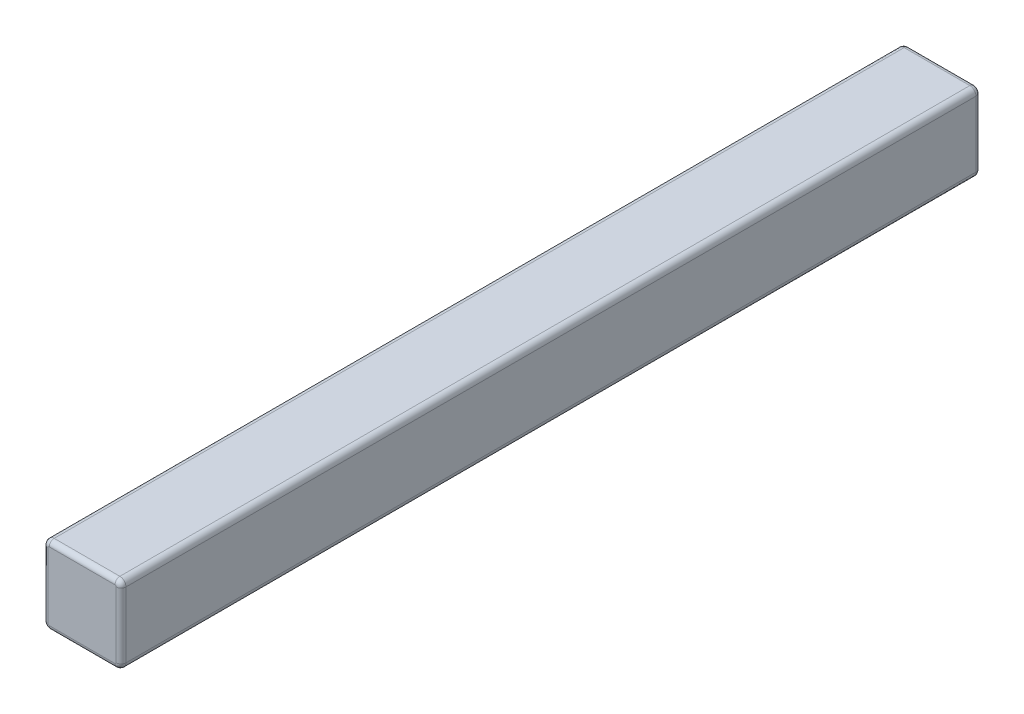
ISO-10303-21;
HEADER;
FILE_DESCRIPTION(('STEP AP214'),'2;1');
FILE_NAME('part.step','',(''),(''),'','','');
FILE_SCHEMA(('AUTOMOTIVE_DESIGN { 1 0 10303 214 1 1 1 1 }'));
ENDSEC;
DATA;
#1=APPLICATION_CONTEXT('core data for automotive mechanical design processes');
#2=APPLICATION_PROTOCOL_DEFINITION('international standard','automotive_design',2000,#1);
#3=PRODUCT_CONTEXT('',#1,'mechanical');
#4=PRODUCT('Part','Part','',(#3));
#5=PRODUCT_RELATED_PRODUCT_CATEGORY('part','',(#4));
#6=PRODUCT_DEFINITION_FORMATION('','',#4);
#7=PRODUCT_DEFINITION_CONTEXT('part definition',#1,'design');
#8=PRODUCT_DEFINITION('design','',#6,#7);
#9=PRODUCT_DEFINITION_SHAPE('','',#8);
#10=(LENGTH_UNIT() NAMED_UNIT(*) SI_UNIT(.MILLI.,.METRE.));
#11=(NAMED_UNIT(*) PLANE_ANGLE_UNIT() SI_UNIT($,.RADIAN.));
#12=(NAMED_UNIT(*) SI_UNIT($,.STERADIAN.) SOLID_ANGLE_UNIT());
#13=UNCERTAINTY_MEASURE_WITH_UNIT(LENGTH_MEASURE(1.E-05),#10,'distance_accuracy_value','');
#14=(GEOMETRIC_REPRESENTATION_CONTEXT(3) GLOBAL_UNCERTAINTY_ASSIGNED_CONTEXT((#13)) GLOBAL_UNIT_ASSIGNED_CONTEXT((#10,
#11,#12)) REPRESENTATION_CONTEXT('',''));
#15=CARTESIAN_POINT('',(0.,0.,0.));
#16=DIRECTION('',(0.,0.,1.));
#17=DIRECTION('',(1.,0.,0.));
#18=AXIS2_PLACEMENT_3D('',#15,#16,#17);
#19=CARTESIAN_POINT('',(-1.3375,1.3375,35.));
#20=DIRECTION('',(0.,0.,-1.));
#21=DIRECTION('',(-1.,0.,0.));
#22=AXIS2_PLACEMENT_3D('',#19,#20,#21);
#23=CYLINDRICAL_SURFACE('',#22,0.25);
#24=DIRECTION('',(0.,0.,-1.));
#25=VECTOR('',#24,1.);
#26=CARTESIAN_POINT('',(-1.3375,1.5875,35.));
#27=LINE('',#26,#25);
#28=CARTESIAN_POINT('',(-1.3375,1.5875,34.8));
#29=VERTEX_POINT('',#28);
#30=CARTESIAN_POINT('',(-1.3375,1.5875,0.199999999999999));
#31=VERTEX_POINT('',#30);
#32=EDGE_CURVE('E267',#29,#31,#27,.T.);
#33=ORIENTED_EDGE('',*,*,#32,.T.);
#34=CARTESIAN_POINT('',(-1.3375,1.3375,0.199999999999999));
#35=DIRECTION('',(0.,0.,1.));
#36=DIRECTION('',(1.,0.,0.));
#37=AXIS2_PLACEMENT_3D('',#34,#35,#36);
#38=CIRCLE('',#37,0.25);
#39=CARTESIAN_POINT('',(-1.5875,1.3375,0.199999999999999));
#40=VERTEX_POINT('',#39);
#41=EDGE_CURVE('E232',#31,#40,#38,.T.);
#42=ORIENTED_EDGE('',*,*,#41,.T.);
#43=DIRECTION('',(0.,0.,-1.));
#44=VECTOR('',#43,1.);
#45=CARTESIAN_POINT('',(-1.5875,1.3375,35.));
#46=LINE('',#45,#44);
#47=CARTESIAN_POINT('',(-1.5875,1.3375,34.8));
#48=VERTEX_POINT('',#47);
#49=EDGE_CURVE('E171',#48,#40,#46,.T.);
#50=ORIENTED_EDGE('',*,*,#49,.F.);
#51=CARTESIAN_POINT('',(-1.3375,1.3375,34.8));
#52=DIRECTION('',(0.,0.,1.));
#53=DIRECTION('',(1.,0.,0.));
#54=AXIS2_PLACEMENT_3D('',#51,#52,#53);
#55=CIRCLE('',#54,0.25);
#56=EDGE_CURVE('E230',#48,#29,#55,.F.);
#57=ORIENTED_EDGE('',*,*,#56,.T.);
#58=EDGE_LOOP('',(#33,#42,#50,#57));
#59=FACE_BOUND('',#58,.T.);
#60=ADVANCED_FACE('F35',(#59),#23,.T.);
#61=CARTESIAN_POINT('',(-1.5875,1.3375,35.));
#62=DIRECTION('',(1.,0.,0.));
#63=DIRECTION('',(0.,0.,-1.));
#64=AXIS2_PLACEMENT_3D('',#61,#62,#63);
#65=PLANE('',#64);
#66=ORIENTED_EDGE('',*,*,#49,.T.);
#67=DIRECTION('',(0.,-1.,0.));
#68=VECTOR('',#67,1.);
#69=CARTESIAN_POINT('',(-1.5875,1.3375,0.199999999999999));
#70=LINE('',#69,#68);
#71=CARTESIAN_POINT('',(-1.5875,-1.3375,0.199999999999999));
#72=VERTEX_POINT('',#71);
#73=EDGE_CURVE('E170',#40,#72,#70,.T.);
#74=ORIENTED_EDGE('',*,*,#73,.T.);
#75=DIRECTION('',(0.,0.,-1.));
#76=VECTOR('',#75,1.);
#77=CARTESIAN_POINT('',(-1.5875,-1.3375,35.));
#78=LINE('',#77,#76);
#79=CARTESIAN_POINT('',(-1.5875,-1.3375,34.8));
#80=VERTEX_POINT('',#79);
#81=EDGE_CURVE('E152',#80,#72,#78,.T.);
#82=ORIENTED_EDGE('',*,*,#81,.F.);
#83=DIRECTION('',(0.,-1.,0.));
#84=VECTOR('',#83,1.);
#85=CARTESIAN_POINT('',(-1.5875,1.3375,34.8));
#86=LINE('',#85,#84);
#87=EDGE_CURVE('E167',#80,#48,#86,.F.);
#88=ORIENTED_EDGE('',*,*,#87,.T.);
#89=EDGE_LOOP('',(#66,#74,#82,#88));
#90=FACE_BOUND('',#89,.T.);
#91=ADVANCED_FACE('F165',(#90),#65,.F.);
#92=CARTESIAN_POINT('',(-1.3375,-1.3375,35.));
#93=DIRECTION('',(0.,0.,-1.));
#94=DIRECTION('',(-1.,0.,0.));
#95=AXIS2_PLACEMENT_3D('',#92,#93,#94);
#96=CYLINDRICAL_SURFACE('',#95,0.25);
#97=ORIENTED_EDGE('',*,*,#81,.T.);
#98=CARTESIAN_POINT('',(-1.3375,-1.3375,0.199999999999999));
#99=DIRECTION('',(0.,0.,1.));
#100=DIRECTION('',(1.,0.,0.));
#101=AXIS2_PLACEMENT_3D('',#98,#99,#100);
#102=CIRCLE('',#101,0.25);
#103=CARTESIAN_POINT('',(-1.3375,-1.5875,0.199999999999999));
#104=VERTEX_POINT('',#103);
#105=EDGE_CURVE('E159',#72,#104,#102,.T.);
#106=ORIENTED_EDGE('',*,*,#105,.T.);
#107=DIRECTION('',(0.,0.,-1.));
#108=VECTOR('',#107,1.);
#109=CARTESIAN_POINT('',(-1.3375,-1.5875,35.));
#110=LINE('',#109,#108);
#111=CARTESIAN_POINT('',(-1.3375,-1.5875,34.8));
#112=VERTEX_POINT('',#111);
#113=EDGE_CURVE('E154',#112,#104,#110,.T.);
#114=ORIENTED_EDGE('',*,*,#113,.F.);
#115=CARTESIAN_POINT('',(-1.3375,-1.3375,34.8));
#116=DIRECTION('',(0.,0.,1.));
#117=DIRECTION('',(1.,0.,0.));
#118=AXIS2_PLACEMENT_3D('',#115,#116,#117);
#119=CIRCLE('',#118,0.25);
#120=EDGE_CURVE('E149',#112,#80,#119,.F.);
#121=ORIENTED_EDGE('',*,*,#120,.T.);
#122=EDGE_LOOP('',(#97,#106,#114,#121));
#123=FACE_BOUND('',#122,.T.);
#124=ADVANCED_FACE('F151',(#123),#96,.T.);
#125=CARTESIAN_POINT('',(-1.3375,-1.5875,35.));
#126=DIRECTION('',(0.,1.,0.));
#127=DIRECTION('',(-1.,0.,0.));
#128=AXIS2_PLACEMENT_3D('',#125,#126,#127);
#129=PLANE('',#128);
#130=ORIENTED_EDGE('',*,*,#113,.T.);
#131=DIRECTION('',(1.,0.,0.));
#132=VECTOR('',#131,1.);
#133=CARTESIAN_POINT('',(-1.3375,-1.5875,0.199999999999999));
#134=LINE('',#133,#132);
#135=CARTESIAN_POINT('',(1.3375,-1.5875,0.199999999999999));
#136=VERTEX_POINT('',#135);
#137=EDGE_CURVE('E211',#104,#136,#134,.T.);
#138=ORIENTED_EDGE('',*,*,#137,.T.);
#139=DIRECTION('',(0.,0.,-1.));
#140=VECTOR('',#139,1.);
#141=CARTESIAN_POINT('',(1.3375,-1.5875,35.));
#142=LINE('',#141,#140);
#143=CARTESIAN_POINT('',(1.3375,-1.5875,34.8));
#144=VERTEX_POINT('',#143);
#145=EDGE_CURVE('E311',#144,#136,#142,.T.);
#146=ORIENTED_EDGE('',*,*,#145,.F.);
#147=DIRECTION('',(1.,0.,0.));
#148=VECTOR('',#147,1.);
#149=CARTESIAN_POINT('',(-1.3375,-1.5875,34.8));
#150=LINE('',#149,#148);
#151=EDGE_CURVE('E209',#144,#112,#150,.F.);
#152=ORIENTED_EDGE('',*,*,#151,.T.);
#153=EDGE_LOOP('',(#130,#138,#146,#152));
#154=FACE_BOUND('',#153,.T.);
#155=ADVANCED_FACE('F316',(#154),#129,.F.);
#156=CARTESIAN_POINT('',(1.3375,-1.3375,35.));
#157=DIRECTION('',(0.,0.,-1.));
#158=DIRECTION('',(-1.,0.,0.));
#159=AXIS2_PLACEMENT_3D('',#156,#157,#158);
#160=CYLINDRICAL_SURFACE('',#159,0.25);
#161=ORIENTED_EDGE('',*,*,#145,.T.);
#162=CARTESIAN_POINT('',(1.3375,-1.3375,0.199999999999999));
#163=DIRECTION('',(0.,0.,1.));
#164=DIRECTION('',(1.,0.,0.));
#165=AXIS2_PLACEMENT_3D('',#162,#163,#164);
#166=CIRCLE('',#165,0.25);
#167=CARTESIAN_POINT('',(1.5875,-1.3375,0.199999999999999));
#168=VERTEX_POINT('',#167);
#169=EDGE_CURVE('E215',#136,#168,#166,.T.);
#170=ORIENTED_EDGE('',*,*,#169,.T.);
#171=DIRECTION('',(0.,0.,-1.));
#172=VECTOR('',#171,1.);
#173=CARTESIAN_POINT('',(1.5875,-1.3375,35.));
#174=LINE('',#173,#172);
#175=CARTESIAN_POINT('',(1.5875,-1.3375,34.8));
#176=VERTEX_POINT('',#175);
#177=EDGE_CURVE('E308',#176,#168,#174,.T.);
#178=ORIENTED_EDGE('',*,*,#177,.F.);
#179=CARTESIAN_POINT('',(1.3375,-1.3375,34.8));
#180=DIRECTION('',(0.,0.,1.));
#181=DIRECTION('',(1.,0.,0.));
#182=AXIS2_PLACEMENT_3D('',#179,#180,#181);
#183=CIRCLE('',#182,0.25);
#184=EDGE_CURVE('E213',#176,#144,#183,.F.);
#185=ORIENTED_EDGE('',*,*,#184,.T.);
#186=EDGE_LOOP('',(#161,#170,#178,#185));
#187=FACE_BOUND('',#186,.T.);
#188=ADVANCED_FACE('F358',(#187),#160,.T.);
#189=CARTESIAN_POINT('',(1.5875,1.3375,35.));
#190=DIRECTION('',(1.,0.,0.));
#191=DIRECTION('',(0.,1.,0.));
#192=AXIS2_PLACEMENT_3D('',#189,#190,#191);
#193=PLANE('',#192);
#194=ORIENTED_EDGE('',*,*,#177,.T.);
#195=DIRECTION('',(0.,-1.,0.));
#196=VECTOR('',#195,1.);
#197=CARTESIAN_POINT('',(1.5875,1.3375,0.2));
#198=LINE('',#197,#196);
#199=CARTESIAN_POINT('',(1.5875,1.3375,0.199999999999999));
#200=VERTEX_POINT('',#199);
#201=EDGE_CURVE('E219',#168,#200,#198,.F.);
#202=ORIENTED_EDGE('',*,*,#201,.T.);
#203=DIRECTION('',(0.,0.,-1.));
#204=VECTOR('',#203,1.);
#205=CARTESIAN_POINT('',(1.5875,1.3375,35.));
#206=LINE('',#205,#204);
#207=CARTESIAN_POINT('',(1.5875,1.3375,34.8));
#208=VERTEX_POINT('',#207);
#209=EDGE_CURVE('E303',#208,#200,#206,.T.);
#210=ORIENTED_EDGE('',*,*,#209,.F.);
#211=DIRECTION('',(0.,-1.,0.));
#212=VECTOR('',#211,1.);
#213=CARTESIAN_POINT('',(1.5875,1.3375,34.8));
#214=LINE('',#213,#212);
#215=EDGE_CURVE('E217',#208,#176,#214,.T.);
#216=ORIENTED_EDGE('',*,*,#215,.T.);
#217=EDGE_LOOP('',(#194,#202,#210,#216));
#218=FACE_BOUND('',#217,.T.);
#219=ADVANCED_FACE('F360',(#218),#193,.T.);
#220=CARTESIAN_POINT('',(1.3375,1.3375,35.));
#221=DIRECTION('',(0.,0.,-1.));
#222=DIRECTION('',(-1.,0.,0.));
#223=AXIS2_PLACEMENT_3D('',#220,#221,#222);
#224=CYLINDRICAL_SURFACE('',#223,0.25);
#225=ORIENTED_EDGE('',*,*,#209,.T.);
#226=CARTESIAN_POINT('',(1.3375,1.3375,0.199999999999999));
#227=DIRECTION('',(0.,0.,1.));
#228=DIRECTION('',(1.,0.,0.));
#229=AXIS2_PLACEMENT_3D('',#226,#227,#228);
#230=CIRCLE('',#229,0.25);
#231=CARTESIAN_POINT('',(1.3375,1.5875,0.199999999999999));
#232=VERTEX_POINT('',#231);
#233=EDGE_CURVE('E223',#200,#232,#230,.T.);
#234=ORIENTED_EDGE('',*,*,#233,.T.);
#235=DIRECTION('',(0.,0.,-1.));
#236=VECTOR('',#235,1.);
#237=CARTESIAN_POINT('',(1.3375,1.5875,35.));
#238=LINE('',#237,#236);
#239=CARTESIAN_POINT('',(1.3375,1.5875,34.8));
#240=VERTEX_POINT('',#239);
#241=EDGE_CURVE('E301',#240,#232,#238,.T.);
#242=ORIENTED_EDGE('',*,*,#241,.F.);
#243=CARTESIAN_POINT('',(1.3375,1.3375,34.8));
#244=DIRECTION('',(0.,0.,1.));
#245=DIRECTION('',(1.,0.,0.));
#246=AXIS2_PLACEMENT_3D('',#243,#244,#245);
#247=CIRCLE('',#246,0.25);
#248=EDGE_CURVE('E221',#240,#208,#247,.F.);
#249=ORIENTED_EDGE('',*,*,#248,.T.);
#250=EDGE_LOOP('',(#225,#234,#242,#249));
#251=FACE_BOUND('',#250,.T.);
#252=ADVANCED_FACE('F411',(#251),#224,.T.);
#253=CARTESIAN_POINT('',(-1.3375,1.5875,35.));
#254=DIRECTION('',(0.,1.,0.));
#255=DIRECTION('',(-1.,0.,0.));
#256=AXIS2_PLACEMENT_3D('',#253,#254,#255);
#257=PLANE('',#256);
#258=ORIENTED_EDGE('',*,*,#241,.T.);
#259=DIRECTION('',(1.,0.,0.));
#260=VECTOR('',#259,1.);
#261=CARTESIAN_POINT('',(-1.3375,1.5875,0.2));
#262=LINE('',#261,#260);
#263=EDGE_CURVE('E228',#232,#31,#262,.F.);
#264=ORIENTED_EDGE('',*,*,#263,.T.);
#265=ORIENTED_EDGE('',*,*,#32,.F.);
#266=DIRECTION('',(1.,0.,0.));
#267=VECTOR('',#266,1.);
#268=CARTESIAN_POINT('',(-1.3375,1.5875,34.8));
#269=LINE('',#268,#267);
#270=EDGE_CURVE('E225',#29,#240,#269,.T.);
#271=ORIENTED_EDGE('',*,*,#270,.T.);
#272=EDGE_LOOP('',(#258,#264,#265,#271));
#273=FACE_BOUND('',#272,.T.);
#274=ADVANCED_FACE('F298',(#273),#257,.T.);
#275=CARTESIAN_POINT('',(-1.3375,1.3375,35.));
#276=DIRECTION('',(0.,0.,1.));
#277=DIRECTION('',(1.,0.,0.));
#278=AXIS2_PLACEMENT_3D('',#275,#276,#277);
#279=PLANE('',#278);
#280=CARTESIAN_POINT('',(1.3375,1.3375,35.));
#281=DIRECTION('',(0.,0.,1.));
#282=DIRECTION('',(1.,0.,0.));
#283=AXIS2_PLACEMENT_3D('',#280,#281,#282);
#284=CIRCLE('',#283,0.0499999999999999);
#285=CARTESIAN_POINT('',(1.3875,1.3375,35.));
#286=VERTEX_POINT('',#285);
#287=CARTESIAN_POINT('',(1.3375,1.3875,35.));
#288=VERTEX_POINT('',#287);
#289=EDGE_CURVE('E44',#286,#288,#284,.T.);
#290=ORIENTED_EDGE('',*,*,#289,.T.);
#291=DIRECTION('',(1.,0.,0.));
#292=VECTOR('',#291,1.);
#293=CARTESIAN_POINT('',(-1.3375,1.3875,35.));
#294=LINE('',#293,#292);
#295=CARTESIAN_POINT('',(-1.3375,1.3875,35.));
#296=VERTEX_POINT('',#295);
#297=EDGE_CURVE('E11',#288,#296,#294,.F.);
#298=ORIENTED_EDGE('',*,*,#297,.T.);
#299=CARTESIAN_POINT('',(-1.3375,1.3375,35.));
#300=DIRECTION('',(0.,0.,1.));
#301=DIRECTION('',(1.,0.,0.));
#302=AXIS2_PLACEMENT_3D('',#299,#300,#301);
#303=CIRCLE('',#302,0.0500000000000001);
#304=CARTESIAN_POINT('',(-1.3875,1.3375,35.));
#305=VERTEX_POINT('',#304);
#306=EDGE_CURVE('E234',#296,#305,#303,.T.);
#307=ORIENTED_EDGE('',*,*,#306,.T.);
#308=DIRECTION('',(0.,-1.,0.));
#309=VECTOR('',#308,1.);
#310=CARTESIAN_POINT('',(-1.3875,-1.3375,35.));
#311=LINE('',#310,#309);
#312=CARTESIAN_POINT('',(-1.3875,-1.3375,35.));
#313=VERTEX_POINT('',#312);
#314=EDGE_CURVE('E236',#305,#313,#311,.T.);
#315=ORIENTED_EDGE('',*,*,#314,.T.);
#316=CARTESIAN_POINT('',(-1.3375,-1.3375,35.));
#317=DIRECTION('',(0.,0.,1.));
#318=DIRECTION('',(1.,0.,0.));
#319=AXIS2_PLACEMENT_3D('',#316,#317,#318);
#320=CIRCLE('',#319,0.05);
#321=CARTESIAN_POINT('',(-1.3375,-1.3875,35.));
#322=VERTEX_POINT('',#321);
#323=EDGE_CURVE('E177',#313,#322,#320,.T.);
#324=ORIENTED_EDGE('',*,*,#323,.T.);
#325=DIRECTION('',(1.,0.,0.));
#326=VECTOR('',#325,1.);
#327=CARTESIAN_POINT('',(1.3375,-1.3875,35.));
#328=LINE('',#327,#326);
#329=CARTESIAN_POINT('',(1.3375,-1.3875,35.));
#330=VERTEX_POINT('',#329);
#331=EDGE_CURVE('E239',#322,#330,#328,.T.);
#332=ORIENTED_EDGE('',*,*,#331,.T.);
#333=CARTESIAN_POINT('',(1.3375,-1.3375,35.));
#334=DIRECTION('',(0.,0.,1.));
#335=DIRECTION('',(1.,0.,0.));
#336=AXIS2_PLACEMENT_3D('',#333,#334,#335);
#337=CIRCLE('',#336,0.0499999999999997);
#338=CARTESIAN_POINT('',(1.3875,-1.3375,35.));
#339=VERTEX_POINT('',#338);
#340=EDGE_CURVE('E241',#330,#339,#337,.T.);
#341=ORIENTED_EDGE('',*,*,#340,.T.);
#342=DIRECTION('',(0.,-1.,0.));
#343=VECTOR('',#342,1.);
#344=CARTESIAN_POINT('',(1.3875,1.3375,35.));
#345=LINE('',#344,#343);
#346=EDGE_CURVE('E55',#339,#286,#345,.F.);
#347=ORIENTED_EDGE('',*,*,#346,.T.);
#348=EDGE_LOOP('',(#290,#298,#307,#315,#324,#332,#341,#347));
#349=FACE_BOUND('',#348,.T.);
#350=ADVANCED_FACE('F285',(#349),#279,.T.);
#351=CARTESIAN_POINT('',(-1.3375,1.3375,0.));
#352=DIRECTION('',(0.,0.,1.));
#353=DIRECTION('',(1.,0.,0.));
#354=AXIS2_PLACEMENT_3D('',#351,#352,#353);
#355=PLANE('',#354);
#356=CARTESIAN_POINT('',(-1.3375,-1.3375,0.));
#357=DIRECTION('',(0.,0.,1.));
#358=DIRECTION('',(1.,0.,0.));
#359=AXIS2_PLACEMENT_3D('',#356,#357,#358);
#360=CIRCLE('',#359,0.05);
#361=CARTESIAN_POINT('',(-1.3375,-1.3875,0.));
#362=VERTEX_POINT('',#361);
#363=CARTESIAN_POINT('',(-1.3875,-1.3375,0.));
#364=VERTEX_POINT('',#363);
#365=EDGE_CURVE('E204',#362,#364,#360,.F.);
#366=ORIENTED_EDGE('',*,*,#365,.T.);
#367=DIRECTION('',(0.,-1.,0.));
#368=VECTOR('',#367,1.);
#369=CARTESIAN_POINT('',(-1.3875,1.3375,0.));
#370=LINE('',#369,#368);
#371=CARTESIAN_POINT('',(-1.3875,1.3375,0.));
#372=VERTEX_POINT('',#371);
#373=EDGE_CURVE('E160',#364,#372,#370,.F.);
#374=ORIENTED_EDGE('',*,*,#373,.T.);
#375=CARTESIAN_POINT('',(-1.3375,1.3375,0.));
#376=DIRECTION('',(0.,0.,1.));
#377=DIRECTION('',(1.,0.,0.));
#378=AXIS2_PLACEMENT_3D('',#375,#376,#377);
#379=CIRCLE('',#378,0.0500000000000001);
#380=CARTESIAN_POINT('',(-1.3375,1.3875,0.));
#381=VERTEX_POINT('',#380);
#382=EDGE_CURVE('E189',#372,#381,#379,.F.);
#383=ORIENTED_EDGE('',*,*,#382,.T.);
#384=DIRECTION('',(1.,0.,0.));
#385=VECTOR('',#384,1.);
#386=CARTESIAN_POINT('',(1.3375,1.3875,0.));
#387=LINE('',#386,#385);
#388=CARTESIAN_POINT('',(1.3375,1.3875,0.));
#389=VERTEX_POINT('',#388);
#390=EDGE_CURVE('E194',#381,#389,#387,.T.);
#391=ORIENTED_EDGE('',*,*,#390,.T.);
#392=CARTESIAN_POINT('',(1.3375,1.3375,0.));
#393=DIRECTION('',(0.,0.,1.));
#394=DIRECTION('',(1.,0.,0.));
#395=AXIS2_PLACEMENT_3D('',#392,#393,#394);
#396=CIRCLE('',#395,0.0499999999999999);
#397=CARTESIAN_POINT('',(1.3875,1.3375,0.));
#398=VERTEX_POINT('',#397);
#399=EDGE_CURVE('E196',#389,#398,#396,.F.);
#400=ORIENTED_EDGE('',*,*,#399,.T.);
#401=DIRECTION('',(0.,-1.,0.));
#402=VECTOR('',#401,1.);
#403=CARTESIAN_POINT('',(1.3875,-1.3375,0.));
#404=LINE('',#403,#402);
#405=CARTESIAN_POINT('',(1.3875,-1.3375,0.));
#406=VERTEX_POINT('',#405);
#407=EDGE_CURVE('E198',#398,#406,#404,.T.);
#408=ORIENTED_EDGE('',*,*,#407,.T.);
#409=CARTESIAN_POINT('',(1.3375,-1.3375,0.));
#410=DIRECTION('',(0.,0.,1.));
#411=DIRECTION('',(1.,0.,0.));
#412=AXIS2_PLACEMENT_3D('',#409,#410,#411);
#413=CIRCLE('',#412,0.0499999999999997);
#414=CARTESIAN_POINT('',(1.3375,-1.3875,0.));
#415=VERTEX_POINT('',#414);
#416=EDGE_CURVE('E200',#406,#415,#413,.F.);
#417=ORIENTED_EDGE('',*,*,#416,.T.);
#418=DIRECTION('',(1.,0.,0.));
#419=VECTOR('',#418,1.);
#420=CARTESIAN_POINT('',(-1.3375,-1.3875,0.));
#421=LINE('',#420,#419);
#422=EDGE_CURVE('E202',#415,#362,#421,.F.);
#423=ORIENTED_EDGE('',*,*,#422,.T.);
#424=EDGE_LOOP('',(#366,#374,#383,#391,#400,#408,#417,#423));
#425=FACE_BOUND('',#424,.T.);
#426=ADVANCED_FACE('F330',(#425),#355,.F.);
#427=CARTESIAN_POINT('',(1.3875,1.3375,0.2));
#428=DIRECTION('',(0.,1.,0.));
#429=DIRECTION('',(-1.,0.,0.));
#430=AXIS2_PLACEMENT_3D('',#427,#428,#429);
#431=CYLINDRICAL_SURFACE('',#430,0.2);
#432=CARTESIAN_POINT('',(1.3875,-1.3375,0.2));
#433=DIRECTION('',(0.,-1.,0.));
#434=DIRECTION('',(0.,0.,-1.));
#435=AXIS2_PLACEMENT_3D('',#432,#433,#434);
#436=CIRCLE('',#435,0.2);
#437=EDGE_CURVE('E261',#406,#168,#436,.T.);
#438=ORIENTED_EDGE('',*,*,#437,.F.);
#439=ORIENTED_EDGE('',*,*,#407,.F.);
#440=CARTESIAN_POINT('',(1.3875,1.3375,0.2));
#441=DIRECTION('',(0.,1.,0.));
#442=DIRECTION('',(0.,0.,1.));
#443=AXIS2_PLACEMENT_3D('',#440,#441,#442);
#444=CIRCLE('',#443,0.2);
#445=EDGE_CURVE('E264',#200,#398,#444,.T.);
#446=ORIENTED_EDGE('',*,*,#445,.F.);
#447=ORIENTED_EDGE('',*,*,#201,.F.);
#448=EDGE_LOOP('',(#438,#439,#446,#447));
#449=FACE_BOUND('',#448,.T.);
#450=ADVANCED_FACE('F350',(#449),#431,.T.);
#451=CARTESIAN_POINT('',(1.3375,1.3375,0.199999999999999));
#452=DIRECTION('',(0.,0.,1.));
#453=DIRECTION('',(1.,0.,0.));
#454=AXIS2_PLACEMENT_3D('',#451,#452,#453);
#455=DEGENERATE_TOROIDAL_SURFACE('',#454,0.0499999999999999,0.2,.T.);
#456=ORIENTED_EDGE('',*,*,#445,.T.);
#457=ORIENTED_EDGE('',*,*,#399,.F.);
#458=CARTESIAN_POINT('',(1.3375,1.3875,0.199999999999999));
#459=DIRECTION('',(-1.,0.,0.));
#460=DIRECTION('',(0.,-1.,0.));
#461=AXIS2_PLACEMENT_3D('',#458,#459,#460);
#462=CIRCLE('',#461,0.2);
#463=EDGE_CURVE('E258',#232,#389,#462,.T.);
#464=ORIENTED_EDGE('',*,*,#463,.F.);
#465=ORIENTED_EDGE('',*,*,#233,.F.);
#466=EDGE_LOOP('',(#456,#457,#464,#465));
#467=FACE_BOUND('',#466,.T.);
#468=ADVANCED_FACE('F345',(#467),#455,.T.);
#469=CARTESIAN_POINT('',(1.3375,-1.3375,0.199999999999999));
#470=DIRECTION('',(0.,0.,1.));
#471=DIRECTION('',(1.,0.,0.));
#472=AXIS2_PLACEMENT_3D('',#469,#470,#471);
#473=DEGENERATE_TOROIDAL_SURFACE('',#472,0.0499999999999997,0.2,.T.);
#474=ORIENTED_EDGE('',*,*,#437,.T.);
#475=ORIENTED_EDGE('',*,*,#169,.F.);
#476=CARTESIAN_POINT('',(1.3375,-1.3875,0.2));
#477=DIRECTION('',(-1.,0.,0.));
#478=DIRECTION('',(0.,0.,1.));
#479=AXIS2_PLACEMENT_3D('',#476,#477,#478);
#480=CIRCLE('',#479,0.2);
#481=EDGE_CURVE('E255',#415,#136,#480,.T.);
#482=ORIENTED_EDGE('',*,*,#481,.F.);
#483=ORIENTED_EDGE('',*,*,#416,.F.);
#484=EDGE_LOOP('',(#474,#475,#482,#483));
#485=FACE_BOUND('',#484,.T.);
#486=ADVANCED_FACE('F355',(#485),#473,.T.);
#487=CARTESIAN_POINT('',(-1.3375,1.3875,0.2));
#488=DIRECTION('',(-1.,0.,0.));
#489=DIRECTION('',(0.,-1.,0.));
#490=AXIS2_PLACEMENT_3D('',#487,#488,#489);
#491=CYLINDRICAL_SURFACE('',#490,0.2);
#492=ORIENTED_EDGE('',*,*,#463,.T.);
#493=ORIENTED_EDGE('',*,*,#390,.F.);
#494=CARTESIAN_POINT('',(-1.3375,1.3875,0.2));
#495=DIRECTION('',(-1.,0.,0.));
#496=DIRECTION('',(0.,0.,1.));
#497=AXIS2_PLACEMENT_3D('',#494,#495,#496);
#498=CIRCLE('',#497,0.2);
#499=EDGE_CURVE('E252',#31,#381,#498,.T.);
#500=ORIENTED_EDGE('',*,*,#499,.F.);
#501=ORIENTED_EDGE('',*,*,#263,.F.);
#502=EDGE_LOOP('',(#492,#493,#500,#501));
#503=FACE_BOUND('',#502,.T.);
#504=ADVANCED_FACE('F341',(#503),#491,.T.);
#505=CARTESIAN_POINT('',(-1.3375,-1.3875,0.199999999999999));
#506=DIRECTION('',(1.,0.,0.));
#507=DIRECTION('',(0.,1.,0.));
#508=AXIS2_PLACEMENT_3D('',#505,#506,#507);
#509=CYLINDRICAL_SURFACE('',#508,0.2);
#510=ORIENTED_EDGE('',*,*,#481,.T.);
#511=ORIENTED_EDGE('',*,*,#137,.F.);
#512=CARTESIAN_POINT('',(-1.3375,-1.3875,0.2));
#513=DIRECTION('',(-1.,0.,0.));
#514=DIRECTION('',(0.,-1.,0.));
#515=AXIS2_PLACEMENT_3D('',#512,#513,#514);
#516=CIRCLE('',#515,0.2);
#517=EDGE_CURVE('E249',#362,#104,#516,.T.);
#518=ORIENTED_EDGE('',*,*,#517,.F.);
#519=ORIENTED_EDGE('',*,*,#422,.F.);
#520=EDGE_LOOP('',(#510,#511,#518,#519));
#521=FACE_BOUND('',#520,.T.);
#522=ADVANCED_FACE('F320',(#521),#509,.T.);
#523=CARTESIAN_POINT('',(-1.3375,1.3375,0.199999999999999));
#524=DIRECTION('',(0.,0.,1.));
#525=DIRECTION('',(1.,0.,0.));
#526=AXIS2_PLACEMENT_3D('',#523,#524,#525);
#527=DEGENERATE_TOROIDAL_SURFACE('',#526,0.0500000000000001,0.2,.T.);
#528=ORIENTED_EDGE('',*,*,#499,.T.);
#529=ORIENTED_EDGE('',*,*,#382,.F.);
#530=CARTESIAN_POINT('',(-1.3875,1.3375,0.199999999999999));
#531=DIRECTION('',(0.,-1.,0.));
#532=DIRECTION('',(0.,0.,-1.));
#533=AXIS2_PLACEMENT_3D('',#530,#531,#532);
#534=CIRCLE('',#533,0.2);
#535=EDGE_CURVE('E247',#40,#372,#534,.T.);
#536=ORIENTED_EDGE('',*,*,#535,.F.);
#537=ORIENTED_EDGE('',*,*,#41,.F.);
#538=EDGE_LOOP('',(#528,#529,#536,#537));
#539=FACE_BOUND('',#538,.T.);
#540=ADVANCED_FACE('F337',(#539),#527,.T.);
#541=CARTESIAN_POINT('',(-1.3375,-1.3375,0.199999999999999));
#542=DIRECTION('',(0.,0.,1.));
#543=DIRECTION('',(1.,0.,0.));
#544=AXIS2_PLACEMENT_3D('',#541,#542,#543);
#545=DEGENERATE_TOROIDAL_SURFACE('',#544,0.05,0.2,.T.);
#546=ORIENTED_EDGE('',*,*,#517,.T.);
#547=ORIENTED_EDGE('',*,*,#105,.F.);
#548=CARTESIAN_POINT('',(-1.3875,-1.3375,0.2));
#549=DIRECTION('',(0.,1.,0.));
#550=DIRECTION('',(0.,0.,1.));
#551=AXIS2_PLACEMENT_3D('',#548,#549,#550);
#552=CIRCLE('',#551,0.2);
#553=EDGE_CURVE('E245',#364,#72,#552,.T.);
#554=ORIENTED_EDGE('',*,*,#553,.F.);
#555=ORIENTED_EDGE('',*,*,#365,.F.);
#556=EDGE_LOOP('',(#546,#547,#554,#555));
#557=FACE_BOUND('',#556,.T.);
#558=ADVANCED_FACE('F326',(#557),#545,.T.);
#559=CARTESIAN_POINT('',(-1.3875,1.3375,0.199999999999999));
#560=DIRECTION('',(0.,-1.,0.));
#561=DIRECTION('',(0.,0.,-1.));
#562=AXIS2_PLACEMENT_3D('',#559,#560,#561);
#563=CYLINDRICAL_SURFACE('',#562,0.2);
#564=ORIENTED_EDGE('',*,*,#535,.T.);
#565=ORIENTED_EDGE('',*,*,#373,.F.);
#566=ORIENTED_EDGE('',*,*,#553,.T.);
#567=ORIENTED_EDGE('',*,*,#73,.F.);
#568=EDGE_LOOP('',(#564,#565,#566,#567));
#569=FACE_BOUND('',#568,.T.);
#570=ADVANCED_FACE('F332',(#569),#563,.T.);
#571=CARTESIAN_POINT('',(-1.3375,-1.3875,34.8));
#572=DIRECTION('',(-1.,0.,0.));
#573=DIRECTION('',(0.,-1.,0.));
#574=AXIS2_PLACEMENT_3D('',#571,#572,#573);
#575=CYLINDRICAL_SURFACE('',#574,0.2);
#576=CARTESIAN_POINT('',(1.3375,-1.3875,34.8));
#577=DIRECTION('',(1.,0.,0.));
#578=DIRECTION('',(0.,0.,-1.));
#579=AXIS2_PLACEMENT_3D('',#576,#577,#578);
#580=CIRCLE('',#579,0.2);
#581=EDGE_CURVE('E180',#330,#144,#580,.T.);
#582=ORIENTED_EDGE('',*,*,#581,.F.);
#583=ORIENTED_EDGE('',*,*,#331,.F.);
#584=CARTESIAN_POINT('',(-1.3375,-1.3875,34.8));
#585=DIRECTION('',(-1.,0.,0.));
#586=DIRECTION('',(0.,0.,1.));
#587=AXIS2_PLACEMENT_3D('',#584,#585,#586);
#588=CIRCLE('',#587,0.2);
#589=EDGE_CURVE('E39',#112,#322,#588,.T.);
#590=ORIENTED_EDGE('',*,*,#589,.F.);
#591=ORIENTED_EDGE('',*,*,#151,.F.);
#592=EDGE_LOOP('',(#582,#583,#590,#591));
#593=FACE_BOUND('',#592,.T.);
#594=ADVANCED_FACE('F37',(#593),#575,.T.);
#595=CARTESIAN_POINT('',(-1.3375,-1.3375,34.8));
#596=DIRECTION('',(0.,0.,1.));
#597=DIRECTION('',(1.,0.,0.));
#598=AXIS2_PLACEMENT_3D('',#595,#596,#597);
#599=DEGENERATE_TOROIDAL_SURFACE('',#598,0.05,0.2,.T.);
#600=ORIENTED_EDGE('',*,*,#589,.T.);
#601=ORIENTED_EDGE('',*,*,#323,.F.);
#602=CARTESIAN_POINT('',(-1.3875,-1.3375,34.8));
#603=DIRECTION('',(0.,1.,0.));
#604=DIRECTION('',(0.,0.,1.));
#605=AXIS2_PLACEMENT_3D('',#602,#603,#604);
#606=CIRCLE('',#605,0.2);
#607=EDGE_CURVE('E175',#80,#313,#606,.T.);
#608=ORIENTED_EDGE('',*,*,#607,.F.);
#609=ORIENTED_EDGE('',*,*,#120,.F.);
#610=EDGE_LOOP('',(#600,#601,#608,#609));
#611=FACE_BOUND('',#610,.T.);
#612=ADVANCED_FACE('F176',(#611),#599,.T.);
#613=CARTESIAN_POINT('',(1.3375,-1.3375,34.8));
#614=DIRECTION('',(0.,0.,1.));
#615=DIRECTION('',(1.,0.,0.));
#616=AXIS2_PLACEMENT_3D('',#613,#614,#615);
#617=DEGENERATE_TOROIDAL_SURFACE('',#616,0.0499999999999997,0.2,.T.);
#618=ORIENTED_EDGE('',*,*,#581,.T.);
#619=ORIENTED_EDGE('',*,*,#184,.F.);
#620=CARTESIAN_POINT('',(1.3875,-1.3375,34.8));
#621=DIRECTION('',(0.,1.,0.));
#622=DIRECTION('',(0.,0.,1.));
#623=AXIS2_PLACEMENT_3D('',#620,#621,#622);
#624=CIRCLE('',#623,0.2);
#625=EDGE_CURVE('E181',#339,#176,#624,.T.);
#626=ORIENTED_EDGE('',*,*,#625,.F.);
#627=ORIENTED_EDGE('',*,*,#340,.F.);
#628=EDGE_LOOP('',(#618,#619,#626,#627));
#629=FACE_BOUND('',#628,.T.);
#630=ADVANCED_FACE('F515',(#629),#617,.T.);
#631=CARTESIAN_POINT('',(-1.3875,1.3375,34.8));
#632=DIRECTION('',(0.,1.,0.));
#633=DIRECTION('',(0.,0.,1.));
#634=AXIS2_PLACEMENT_3D('',#631,#632,#633);
#635=CYLINDRICAL_SURFACE('',#634,0.2);
#636=ORIENTED_EDGE('',*,*,#607,.T.);
#637=ORIENTED_EDGE('',*,*,#314,.F.);
#638=CARTESIAN_POINT('',(-1.3875,1.3375,34.8));
#639=DIRECTION('',(0.,1.,0.));
#640=DIRECTION('',(0.,0.,1.));
#641=AXIS2_PLACEMENT_3D('',#638,#639,#640);
#642=CIRCLE('',#641,0.2);
#643=EDGE_CURVE('E186',#48,#305,#642,.T.);
#644=ORIENTED_EDGE('',*,*,#643,.F.);
#645=ORIENTED_EDGE('',*,*,#87,.F.);
#646=EDGE_LOOP('',(#636,#637,#644,#645));
#647=FACE_BOUND('',#646,.T.);
#648=ADVANCED_FACE('F184',(#647),#635,.T.);
#649=CARTESIAN_POINT('',(1.3875,1.3375,34.8));
#650=DIRECTION('',(0.,-1.,0.));
#651=DIRECTION('',(1.,0.,0.));
#652=AXIS2_PLACEMENT_3D('',#649,#650,#651);
#653=CYLINDRICAL_SURFACE('',#652,0.2);
#654=ORIENTED_EDGE('',*,*,#625,.T.);
#655=ORIENTED_EDGE('',*,*,#215,.F.);
#656=CARTESIAN_POINT('',(1.3875,1.3375,34.8));
#657=DIRECTION('',(0.,1.,0.));
#658=DIRECTION('',(0.,0.,1.));
#659=AXIS2_PLACEMENT_3D('',#656,#657,#658);
#660=CIRCLE('',#659,0.2);
#661=EDGE_CURVE('E272',#286,#208,#660,.T.);
#662=ORIENTED_EDGE('',*,*,#661,.F.);
#663=ORIENTED_EDGE('',*,*,#346,.F.);
#664=EDGE_LOOP('',(#654,#655,#662,#663));
#665=FACE_BOUND('',#664,.T.);
#666=ADVANCED_FACE('F364',(#665),#653,.T.);
#667=CARTESIAN_POINT('',(-1.3375,1.3375,34.8));
#668=DIRECTION('',(0.,0.,1.));
#669=DIRECTION('',(1.,0.,0.));
#670=AXIS2_PLACEMENT_3D('',#667,#668,#669);
#671=DEGENERATE_TOROIDAL_SURFACE('',#670,0.0500000000000001,0.2,.T.);
#672=ORIENTED_EDGE('',*,*,#643,.T.);
#673=ORIENTED_EDGE('',*,*,#306,.F.);
#674=CARTESIAN_POINT('',(-1.3375,1.3875,34.8));
#675=DIRECTION('',(1.,0.,0.));
#676=DIRECTION('',(0.,0.,-1.));
#677=AXIS2_PLACEMENT_3D('',#674,#675,#676);
#678=CIRCLE('',#677,0.2);
#679=EDGE_CURVE('E270',#29,#296,#678,.T.);
#680=ORIENTED_EDGE('',*,*,#679,.F.);
#681=ORIENTED_EDGE('',*,*,#56,.F.);
#682=EDGE_LOOP('',(#672,#673,#680,#681));
#683=FACE_BOUND('',#682,.T.);
#684=ADVANCED_FACE('F289',(#683),#671,.T.);
#685=CARTESIAN_POINT('',(1.3375,1.3375,34.8));
#686=DIRECTION('',(0.,0.,1.));
#687=DIRECTION('',(1.,0.,0.));
#688=AXIS2_PLACEMENT_3D('',#685,#686,#687);
#689=DEGENERATE_TOROIDAL_SURFACE('',#688,0.0499999999999999,0.2,.T.);
#690=ORIENTED_EDGE('',*,*,#661,.T.);
#691=ORIENTED_EDGE('',*,*,#248,.F.);
#692=CARTESIAN_POINT('',(1.3375,1.3875,34.8));
#693=DIRECTION('',(-1.,0.,0.));
#694=DIRECTION('',(0.,0.,1.));
#695=AXIS2_PLACEMENT_3D('',#692,#693,#694);
#696=CIRCLE('',#695,0.2);
#697=EDGE_CURVE('E268',#288,#240,#696,.T.);
#698=ORIENTED_EDGE('',*,*,#697,.F.);
#699=ORIENTED_EDGE('',*,*,#289,.F.);
#700=EDGE_LOOP('',(#690,#691,#698,#699));
#701=FACE_BOUND('',#700,.T.);
#702=ADVANCED_FACE('F367',(#701),#689,.T.);
#703=CARTESIAN_POINT('',(-1.3375,1.3875,34.8));
#704=DIRECTION('',(1.,0.,0.));
#705=DIRECTION('',(0.,1.,0.));
#706=AXIS2_PLACEMENT_3D('',#703,#704,#705);
#707=CYLINDRICAL_SURFACE('',#706,0.2);
#708=ORIENTED_EDGE('',*,*,#679,.T.);
#709=ORIENTED_EDGE('',*,*,#297,.F.);
#710=ORIENTED_EDGE('',*,*,#697,.T.);
#711=ORIENTED_EDGE('',*,*,#270,.F.);
#712=EDGE_LOOP('',(#708,#709,#710,#711));
#713=FACE_BOUND('',#712,.T.);
#714=ADVANCED_FACE('F370',(#713),#707,.T.);
#715=CLOSED_SHELL('',(#60,#91,#124,#155,#188,#219,#252,#274,#350,#426,#450,#468,#486,#504,#522,
#540,#558,#570,#594,#612,#630,#648,#666,#684,#702,#714));
#716=MANIFOLD_SOLID_BREP('B2',#715);
#717=ADVANCED_BREP_SHAPE_REPRESENTATION('',(#18,#716),#14);
#718=SHAPE_DEFINITION_REPRESENTATION(#9,#717);
ENDSEC;
END-ISO-10303-21;
